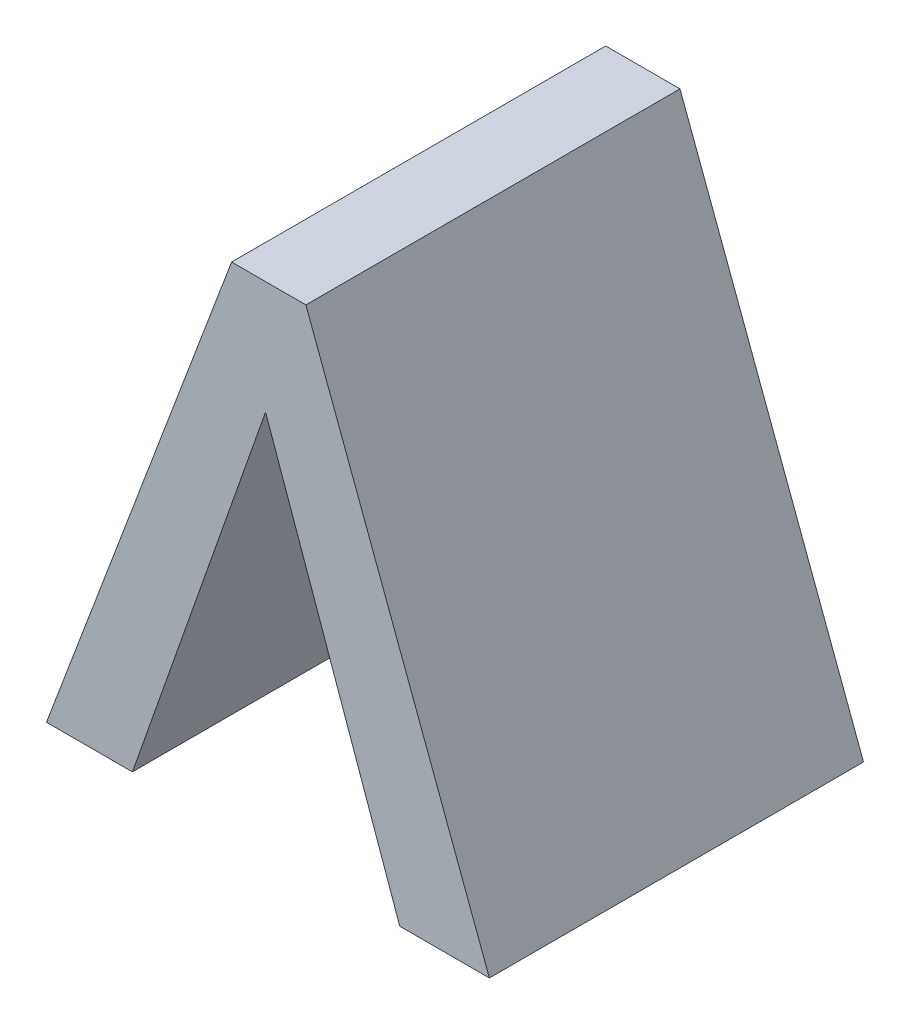
ISO-10303-21;
HEADER;
FILE_DESCRIPTION(('STEP AP214'),'2;1');
FILE_NAME('part.step','',(''),(''),'','','');
FILE_SCHEMA(('AUTOMOTIVE_DESIGN { 1 0 10303 214 1 1 1 1 }'));
ENDSEC;
DATA;
#1=APPLICATION_CONTEXT('core data for automotive mechanical design processes');
#2=APPLICATION_PROTOCOL_DEFINITION('international standard','automotive_design',2000,#1);
#3=PRODUCT_CONTEXT('',#1,'mechanical');
#4=PRODUCT('Part','Part','',(#3));
#5=PRODUCT_RELATED_PRODUCT_CATEGORY('part','',(#4));
#6=PRODUCT_DEFINITION_FORMATION('','',#4);
#7=PRODUCT_DEFINITION_CONTEXT('part definition',#1,'design');
#8=PRODUCT_DEFINITION('design','',#6,#7);
#9=PRODUCT_DEFINITION_SHAPE('','',#8);
#10=(LENGTH_UNIT() NAMED_UNIT(*) SI_UNIT(.MILLI.,.METRE.));
#11=(NAMED_UNIT(*) PLANE_ANGLE_UNIT() SI_UNIT($,.RADIAN.));
#12=(NAMED_UNIT(*) SI_UNIT($,.STERADIAN.) SOLID_ANGLE_UNIT());
#13=UNCERTAINTY_MEASURE_WITH_UNIT(LENGTH_MEASURE(1.E-05),#10,'distance_accuracy_value','');
#14=(GEOMETRIC_REPRESENTATION_CONTEXT(3) GLOBAL_UNCERTAINTY_ASSIGNED_CONTEXT((#13)) GLOBAL_UNIT_ASSIGNED_CONTEXT((#10,
#11,#12)) REPRESENTATION_CONTEXT('',''));
#15=CARTESIAN_POINT('',(0.,0.,0.));
#16=DIRECTION('',(0.,0.,1.));
#17=DIRECTION('',(1.,0.,0.));
#18=AXIS2_PLACEMENT_3D('',#15,#16,#17);
#19=CARTESIAN_POINT('',(5.6714478826829,1.6541374403639,0.));
#20=DIRECTION('',(0.,1.,0.));
#21=DIRECTION('',(-1.,0.,0.));
#22=AXIS2_PLACEMENT_3D('',#19,#20,#21);
#23=PLANE('',#22);
#24=DIRECTION('',(1.,0.,0.));
#25=VECTOR('',#24,1.);
#26=CARTESIAN_POINT('',(5.6515982867627,1.6541374403639,0.));
#27=LINE('',#26,#25);
#28=CARTESIAN_POINT('',(5.6515982867627,1.6541374403639,0.));
#29=VERTEX_POINT('',#28);
#30=CARTESIAN_POINT('',(5.6714478826829,1.6541374403639,0.));
#31=VERTEX_POINT('',#30);
#32=EDGE_CURVE('E11',#29,#31,#27,.T.);
#33=ORIENTED_EDGE('',*,*,#32,.F.);
#34=DIRECTION('',(0.,0.,1.));
#35=VECTOR('',#34,1.);
#36=CARTESIAN_POINT('',(5.6515982867627,1.6541374403639,0.));
#37=LINE('',#36,#35);
#38=CARTESIAN_POINT('',(5.6515982867627,1.6541374403639,0.1));
#39=VERTEX_POINT('',#38);
#40=EDGE_CURVE('E24',#29,#39,#37,.T.);
#41=ORIENTED_EDGE('',*,*,#40,.T.);
#42=DIRECTION('',(-1.,0.,0.));
#43=VECTOR('',#42,1.);
#44=CARTESIAN_POINT('',(5.6515982867627,1.6541374403639,0.1));
#45=LINE('',#44,#43);
#46=CARTESIAN_POINT('',(5.6714478826829,1.6541374403639,0.1));
#47=VERTEX_POINT('',#46);
#48=EDGE_CURVE('E94',#47,#39,#45,.T.);
#49=ORIENTED_EDGE('',*,*,#48,.F.);
#50=DIRECTION('',(0.,0.,1.));
#51=VECTOR('',#50,1.);
#52=CARTESIAN_POINT('',(5.6714478826829,1.6541374403639,0.));
#53=LINE('',#52,#51);
#54=EDGE_CURVE('E127',#31,#47,#53,.T.);
#55=ORIENTED_EDGE('',*,*,#54,.F.);
#56=EDGE_LOOP('',(#33,#41,#49,#55));
#57=FACE_BOUND('',#56,.T.);
#58=ADVANCED_FACE('F17',(#57),#23,.T.);
#59=CARTESIAN_POINT('',(5.7205047411713,1.5228465416346,0.));
#60=DIRECTION('',(0.936744248481592,0.350014589605431,0.));
#61=DIRECTION('',(-0.350014589605431,0.936744248481592,0.));
#62=AXIS2_PLACEMENT_3D('',#59,#60,#61);
#63=PLANE('',#62);
#64=DIRECTION('',(0.350014589605431,-0.936744248481592,0.));
#65=VECTOR('',#64,1.);
#66=CARTESIAN_POINT('',(5.6714478826829,1.6541374403639,0.));
#67=LINE('',#66,#65);
#68=CARTESIAN_POINT('',(5.7205047411713,1.5228465416346,0.));
#69=VERTEX_POINT('',#68);
#70=EDGE_CURVE('E125',#31,#69,#67,.T.);
#71=ORIENTED_EDGE('',*,*,#70,.F.);
#72=ORIENTED_EDGE('',*,*,#54,.T.);
#73=DIRECTION('',(-0.350014589605431,0.936744248481592,0.));
#74=VECTOR('',#73,1.);
#75=CARTESIAN_POINT('',(5.6714478826829,1.6541374403639,0.1));
#76=LINE('',#75,#74);
#77=CARTESIAN_POINT('',(5.7205047411713,1.5228465416346,0.1));
#78=VERTEX_POINT('',#77);
#79=EDGE_CURVE('E123',#78,#47,#76,.T.);
#80=ORIENTED_EDGE('',*,*,#79,.F.);
#81=DIRECTION('',(0.,0.,1.));
#82=VECTOR('',#81,1.);
#83=CARTESIAN_POINT('',(5.7205047411713,1.5228465416346,0.));
#84=LINE('',#83,#82);
#85=EDGE_CURVE('E120',#69,#78,#84,.T.);
#86=ORIENTED_EDGE('',*,*,#85,.F.);
#87=EDGE_LOOP('',(#71,#72,#80,#86));
#88=FACE_BOUND('',#87,.T.);
#89=ADVANCED_FACE('F145',(#88),#63,.T.);
#90=CARTESIAN_POINT('',(5.6965434432391,1.5228465416346,0.));
#91=DIRECTION('',(0.,-1.,0.));
#92=DIRECTION('',(1.,0.,0.));
#93=AXIS2_PLACEMENT_3D('',#90,#91,#92);
#94=PLANE('',#93);
#95=DIRECTION('',(-1.,0.,0.));
#96=VECTOR('',#95,1.);
#97=CARTESIAN_POINT('',(5.7205047411713,1.5228465416346,0.));
#98=LINE('',#97,#96);
#99=CARTESIAN_POINT('',(5.6965434432391,1.5228465416346,0.));
#100=VERTEX_POINT('',#99);
#101=EDGE_CURVE('E118',#69,#100,#98,.T.);
#102=ORIENTED_EDGE('',*,*,#101,.F.);
#103=ORIENTED_EDGE('',*,*,#85,.T.);
#104=DIRECTION('',(1.,0.,0.));
#105=VECTOR('',#104,1.);
#106=CARTESIAN_POINT('',(5.7205047411713,1.5228465416346,0.1));
#107=LINE('',#106,#105);
#108=CARTESIAN_POINT('',(5.6965434432391,1.5228465416346,0.1));
#109=VERTEX_POINT('',#108);
#110=EDGE_CURVE('E115',#109,#78,#107,.T.);
#111=ORIENTED_EDGE('',*,*,#110,.F.);
#112=DIRECTION('',(0.,0.,1.));
#113=VECTOR('',#112,1.);
#114=CARTESIAN_POINT('',(5.6965434432391,1.5228465416346,0.));
#115=LINE('',#114,#113);
#116=EDGE_CURVE('E112',#100,#109,#115,.T.);
#117=ORIENTED_EDGE('',*,*,#116,.F.);
#118=EDGE_LOOP('',(#102,#103,#111,#117));
#119=FACE_BOUND('',#118,.T.);
#120=ADVANCED_FACE('F141',(#119),#94,.T.);
#121=CARTESIAN_POINT('',(5.6606723877547,1.6239376979996,0.));
#122=DIRECTION('',(-0.942427745481245,-0.33440984517077,0.));
#123=DIRECTION('',(0.33440984517077,-0.942427745481245,0.));
#124=AXIS2_PLACEMENT_3D('',#121,#122,#123);
#125=PLANE('',#124);
#126=DIRECTION('',(-0.33440984517077,0.942427745481245,0.));
#127=VECTOR('',#126,1.);
#128=CARTESIAN_POINT('',(5.6965434432391,1.5228465416346,0.));
#129=LINE('',#128,#127);
#130=CARTESIAN_POINT('',(5.6606723877547,1.6239376979996,0.));
#131=VERTEX_POINT('',#130);
#132=EDGE_CURVE('E110',#100,#131,#129,.T.);
#133=ORIENTED_EDGE('',*,*,#132,.F.);
#134=ORIENTED_EDGE('',*,*,#116,.T.);
#135=DIRECTION('',(0.33440984517077,-0.942427745481245,0.));
#136=VECTOR('',#135,1.);
#137=CARTESIAN_POINT('',(5.6965434432391,1.5228465416346,0.1));
#138=LINE('',#137,#136);
#139=CARTESIAN_POINT('',(5.6606723877547,1.6239376979996,0.1));
#140=VERTEX_POINT('',#139);
#141=EDGE_CURVE('E107',#140,#109,#138,.T.);
#142=ORIENTED_EDGE('',*,*,#141,.F.);
#143=DIRECTION('',(0.,0.,1.));
#144=VECTOR('',#143,1.);
#145=CARTESIAN_POINT('',(5.6606723877547,1.6239376979996,0.));
#146=LINE('',#145,#144);
#147=EDGE_CURVE('E104',#131,#140,#146,.T.);
#148=ORIENTED_EDGE('',*,*,#147,.F.);
#149=EDGE_LOOP('',(#133,#134,#142,#148));
#150=FACE_BOUND('',#149,.T.);
#151=ADVANCED_FACE('F137',(#150),#125,.T.);
#152=CARTESIAN_POINT('',(5.6250848979264,1.5228465416346,0.));
#153=DIRECTION('',(0.943258685640992,-0.332058807988628,0.));
#154=DIRECTION('',(0.332058807988628,0.943258685640992,0.));
#155=AXIS2_PLACEMENT_3D('',#152,#153,#154);
#156=PLANE('',#155);
#157=DIRECTION('',(-0.332058807988628,-0.943258685640992,0.));
#158=VECTOR('',#157,1.);
#159=CARTESIAN_POINT('',(5.6606723877547,1.6239376979996,0.));
#160=LINE('',#159,#158);
#161=CARTESIAN_POINT('',(5.6250848979264,1.5228465416346,0.));
#162=VERTEX_POINT('',#161);
#163=EDGE_CURVE('E102',#131,#162,#160,.T.);
#164=ORIENTED_EDGE('',*,*,#163,.F.);
#165=ORIENTED_EDGE('',*,*,#147,.T.);
#166=DIRECTION('',(0.332058807988628,0.943258685640992,0.));
#167=VECTOR('',#166,1.);
#168=CARTESIAN_POINT('',(5.6606723877547,1.6239376979996,0.1));
#169=LINE('',#168,#167);
#170=CARTESIAN_POINT('',(5.6250848979264,1.5228465416346,0.1));
#171=VERTEX_POINT('',#170);
#172=EDGE_CURVE('E100',#171,#140,#169,.T.);
#173=ORIENTED_EDGE('',*,*,#172,.F.);
#174=DIRECTION('',(0.,0.,1.));
#175=VECTOR('',#174,1.);
#176=CARTESIAN_POINT('',(5.6250848979264,1.5228465416346,0.));
#177=LINE('',#176,#175);
#178=EDGE_CURVE('E79',#162,#171,#177,.T.);
#179=ORIENTED_EDGE('',*,*,#178,.F.);
#180=EDGE_LOOP('',(#164,#165,#173,#179));
#181=FACE_BOUND('',#180,.T.);
#182=ADVANCED_FACE('F135',(#181),#156,.T.);
#183=CARTESIAN_POINT('',(5.6021160797902,1.5228465416346,0.));
#184=DIRECTION('',(0.,-1.,0.));
#185=DIRECTION('',(1.,0.,0.));
#186=AXIS2_PLACEMENT_3D('',#183,#184,#185);
#187=PLANE('',#186);
#188=DIRECTION('',(-1.,0.,0.));
#189=VECTOR('',#188,1.);
#190=CARTESIAN_POINT('',(5.6250848979264,1.5228465416346,0.));
#191=LINE('',#190,#189);
#192=CARTESIAN_POINT('',(5.6021160797902,1.5228465416346,0.));
#193=VERTEX_POINT('',#192);
#194=EDGE_CURVE('E83',#162,#193,#191,.T.);
#195=ORIENTED_EDGE('',*,*,#194,.F.);
#196=ORIENTED_EDGE('',*,*,#178,.T.);
#197=DIRECTION('',(1.,0.,0.));
#198=VECTOR('',#197,1.);
#199=CARTESIAN_POINT('',(5.6250848979264,1.5228465416346,0.1));
#200=LINE('',#199,#198);
#201=CARTESIAN_POINT('',(5.6021160797902,1.5228465416346,0.1));
#202=VERTEX_POINT('',#201);
#203=EDGE_CURVE('E72',#202,#171,#200,.T.);
#204=ORIENTED_EDGE('',*,*,#203,.F.);
#205=DIRECTION('',(0.,0.,1.));
#206=VECTOR('',#205,1.);
#207=CARTESIAN_POINT('',(5.6021160797902,1.5228465416346,0.));
#208=LINE('',#207,#206);
#209=EDGE_CURVE('E76',#193,#202,#208,.T.);
#210=ORIENTED_EDGE('',*,*,#209,.F.);
#211=EDGE_LOOP('',(#195,#196,#204,#210));
#212=FACE_BOUND('',#211,.T.);
#213=ADVANCED_FACE('F75',(#212),#187,.T.);
#214=CARTESIAN_POINT('',(5.6515982867627,1.6541374403639,0.));
#215=DIRECTION('',(-0.935746495818411,0.352673355335449,0.));
#216=DIRECTION('',(-0.352673355335449,-0.935746495818411,0.));
#217=AXIS2_PLACEMENT_3D('',#214,#215,#216);
#218=PLANE('',#217);
#219=DIRECTION('',(0.352673355335449,0.935746495818411,0.));
#220=VECTOR('',#219,1.);
#221=CARTESIAN_POINT('',(5.6021160797902,1.5228465416346,0.));
#222=LINE('',#221,#220);
#223=EDGE_CURVE('E89',#193,#29,#222,.T.);
#224=ORIENTED_EDGE('',*,*,#223,.F.);
#225=ORIENTED_EDGE('',*,*,#209,.T.);
#226=DIRECTION('',(-0.352673355335449,-0.935746495818411,0.));
#227=VECTOR('',#226,1.);
#228=CARTESIAN_POINT('',(5.6021160797902,1.5228465416346,0.1));
#229=LINE('',#228,#227);
#230=EDGE_CURVE('E88',#39,#202,#229,.T.);
#231=ORIENTED_EDGE('',*,*,#230,.F.);
#232=ORIENTED_EDGE('',*,*,#40,.F.);
#233=EDGE_LOOP('',(#224,#225,#231,#232));
#234=FACE_BOUND('',#233,.T.);
#235=ADVANCED_FACE('F87',(#234),#218,.T.);
#236=CARTESIAN_POINT('',(5.6612114468742,1.5795621699845,0.));
#237=DIRECTION('',(0.,0.,1.));
#238=DIRECTION('',(1.,0.,0.));
#239=AXIS2_PLACEMENT_3D('',#236,#237,#238);
#240=PLANE('',#239);
#241=ORIENTED_EDGE('',*,*,#223,.T.);
#242=ORIENTED_EDGE('',*,*,#32,.T.);
#243=ORIENTED_EDGE('',*,*,#70,.T.);
#244=ORIENTED_EDGE('',*,*,#101,.T.);
#245=ORIENTED_EDGE('',*,*,#132,.T.);
#246=ORIENTED_EDGE('',*,*,#163,.T.);
#247=ORIENTED_EDGE('',*,*,#194,.T.);
#248=EDGE_LOOP('',(#241,#242,#243,#244,#245,#246,#247));
#249=FACE_BOUND('',#248,.T.);
#250=ADVANCED_FACE('F130',(#249),#240,.F.);
#251=CARTESIAN_POINT('',(5.6612114468742,1.5795621699845,0.1));
#252=DIRECTION('',(0.,0.,1.));
#253=DIRECTION('',(1.,0.,0.));
#254=AXIS2_PLACEMENT_3D('',#251,#252,#253);
#255=PLANE('',#254);
#256=ORIENTED_EDGE('',*,*,#230,.T.);
#257=ORIENTED_EDGE('',*,*,#203,.T.);
#258=ORIENTED_EDGE('',*,*,#172,.T.);
#259=ORIENTED_EDGE('',*,*,#141,.T.);
#260=ORIENTED_EDGE('',*,*,#110,.T.);
#261=ORIENTED_EDGE('',*,*,#79,.T.);
#262=ORIENTED_EDGE('',*,*,#48,.T.);
#263=EDGE_LOOP('',(#256,#257,#258,#259,#260,#261,#262));
#264=FACE_BOUND('',#263,.T.);
#265=ADVANCED_FACE('F92',(#264),#255,.T.);
#266=CLOSED_SHELL('',(#58,#89,#120,#151,#182,#213,#235,#250,#265));
#267=MANIFOLD_SOLID_BREP('B1',#266);
#268=ADVANCED_BREP_SHAPE_REPRESENTATION('',(#18,#267),#14);
#269=SHAPE_DEFINITION_REPRESENTATION(#9,#268);
ENDSEC;
END-ISO-10303-21;
